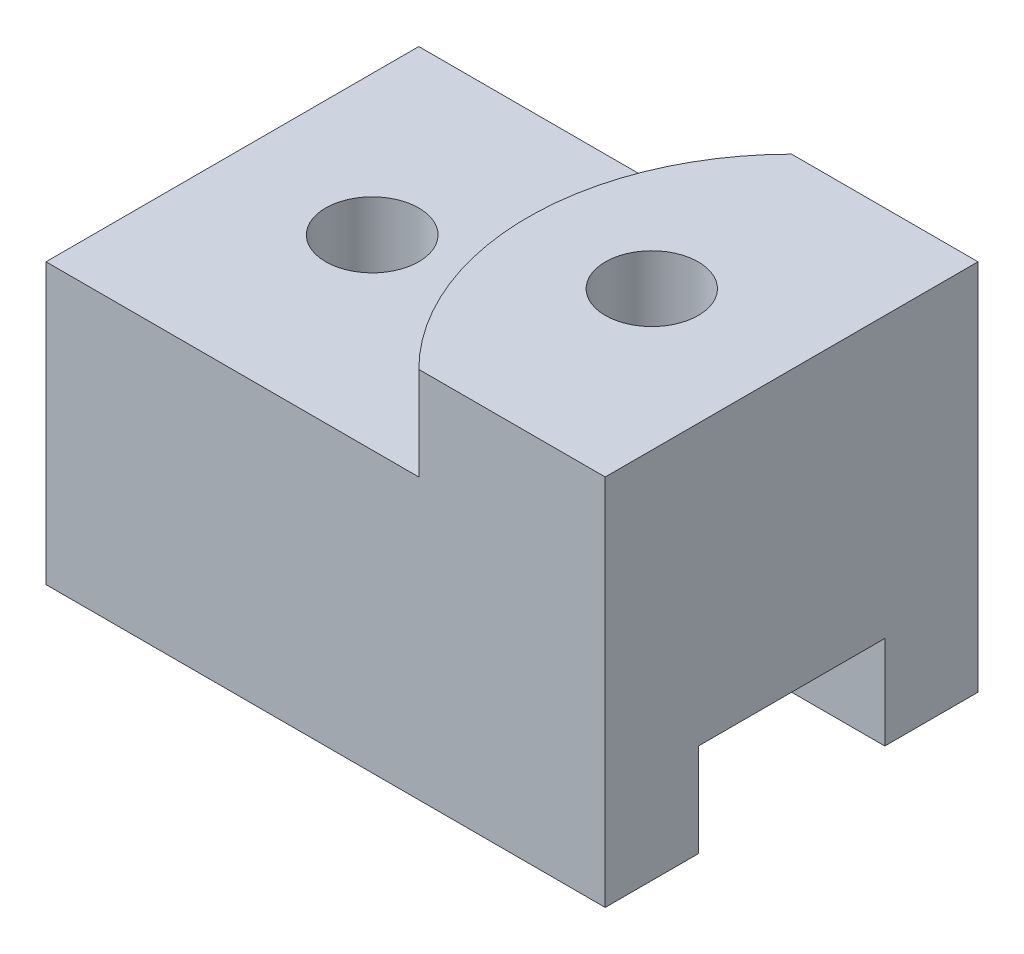
ISO-10303-21;
HEADER;
FILE_DESCRIPTION(('STEP AP214'),'2;1');
FILE_NAME('part.step','',(''),(''),'','','');
FILE_SCHEMA(('AUTOMOTIVE_DESIGN { 1 0 10303 214 1 1 1 1 }'));
ENDSEC;
DATA;
#1=APPLICATION_CONTEXT('core data for automotive mechanical design processes');
#2=APPLICATION_PROTOCOL_DEFINITION('international standard','automotive_design',2000,#1);
#3=PRODUCT_CONTEXT('',#1,'mechanical');
#4=PRODUCT('Part','Part','',(#3));
#5=PRODUCT_RELATED_PRODUCT_CATEGORY('part','',(#4));
#6=PRODUCT_DEFINITION_FORMATION('','',#4);
#7=PRODUCT_DEFINITION_CONTEXT('part definition',#1,'design');
#8=PRODUCT_DEFINITION('design','',#6,#7);
#9=PRODUCT_DEFINITION_SHAPE('','',#8);
#10=(LENGTH_UNIT() NAMED_UNIT(*) SI_UNIT(.MILLI.,.METRE.));
#11=(NAMED_UNIT(*) PLANE_ANGLE_UNIT() SI_UNIT($,.RADIAN.));
#12=(NAMED_UNIT(*) SI_UNIT($,.STERADIAN.) SOLID_ANGLE_UNIT());
#13=UNCERTAINTY_MEASURE_WITH_UNIT(LENGTH_MEASURE(1.E-05),#10,'distance_accuracy_value','');
#14=(GEOMETRIC_REPRESENTATION_CONTEXT(3) GLOBAL_UNCERTAINTY_ASSIGNED_CONTEXT((#13)) GLOBAL_UNIT_ASSIGNED_CONTEXT((#10,
#11,#12)) REPRESENTATION_CONTEXT('',''));
#15=CARTESIAN_POINT('',(0.,0.,0.));
#16=DIRECTION('',(0.,0.,1.));
#17=DIRECTION('',(1.,0.,0.));
#18=AXIS2_PLACEMENT_3D('',#15,#16,#17);
#19=CARTESIAN_POINT('',(38.1,25.4,-50.8));
#20=DIRECTION('',(0.,1.,0.));
#21=DIRECTION('',(0.,0.,1.));
#22=AXIS2_PLACEMENT_3D('',#19,#20,#21);
#23=CYLINDRICAL_SURFACE('',#22,12.7);
#24=CARTESIAN_POINT('',(38.1,76.2,-50.8));
#25=DIRECTION('',(0.,1.,0.));
#26=DIRECTION('',(0.,0.,1.));
#27=AXIS2_PLACEMENT_3D('',#24,#25,#26);
#28=CIRCLE('',#27,12.7);
#29=CARTESIAN_POINT('',(38.1,76.2,-38.1));
#30=VERTEX_POINT('',#29);
#31=EDGE_CURVE('E296',#30,#30,#28,.T.);
#32=ORIENTED_EDGE('',*,*,#31,.T.);
#33=EDGE_LOOP('',(#32));
#34=FACE_BOUND('',#33,.T.);
#35=CARTESIAN_POINT('',(38.1,33.782,-50.8));
#36=DIRECTION('',(0.,-1.,0.));
#37=DIRECTION('',(0.,0.,-1.));
#38=AXIS2_PLACEMENT_3D('',#35,#36,#37);
#39=CIRCLE('',#38,12.7);
#40=CARTESIAN_POINT('',(38.1,33.782,-63.5));
#41=VERTEX_POINT('',#40);
#42=EDGE_CURVE('E49',#41,#41,#39,.F.);
#43=ORIENTED_EDGE('',*,*,#42,.F.);
#44=EDGE_LOOP('',(#43));
#45=FACE_BOUND('',#44,.T.);
#46=ADVANCED_FACE('F45',(#34,#45),#23,.F.);
#47=CARTESIAN_POINT('',(0.,101.6,0.));
#48=DIRECTION('',(-1.,0.,0.));
#49=DIRECTION('',(0.,0.,1.));
#50=AXIS2_PLACEMENT_3D('',#47,#48,#49);
#51=PLANE('',#50);
#52=DIRECTION('',(0.,-1.,0.));
#53=VECTOR('',#52,1.);
#54=CARTESIAN_POINT('',(0.,101.6,0.));
#55=LINE('',#54,#53);
#56=CARTESIAN_POINT('',(0.,76.2,0.));
#57=VERTEX_POINT('',#56);
#58=CARTESIAN_POINT('',(0.,0.,0.));
#59=VERTEX_POINT('',#58);
#60=EDGE_CURVE('E11',#57,#59,#55,.T.);
#61=ORIENTED_EDGE('',*,*,#60,.F.);
#62=DIRECTION('',(0.,0.,1.));
#63=VECTOR('',#62,1.);
#64=CARTESIAN_POINT('',(0.,76.2,-101.6));
#65=LINE('',#64,#63);
#66=CARTESIAN_POINT('',(0.,76.2,-101.6));
#67=VERTEX_POINT('',#66);
#68=EDGE_CURVE('E143',#67,#57,#65,.T.);
#69=ORIENTED_EDGE('',*,*,#68,.F.);
#70=DIRECTION('',(0.,-1.,0.));
#71=VECTOR('',#70,1.);
#72=CARTESIAN_POINT('',(0.,101.6,-101.6));
#73=LINE('',#72,#71);
#74=CARTESIAN_POINT('',(0.,0.,-101.6));
#75=VERTEX_POINT('',#74);
#76=EDGE_CURVE('E220',#67,#75,#73,.T.);
#77=ORIENTED_EDGE('',*,*,#76,.T.);
#78=DIRECTION('',(0.,0.,-1.));
#79=VECTOR('',#78,1.);
#80=CARTESIAN_POINT('',(0.,0.,0.));
#81=LINE('',#80,#79);
#82=CARTESIAN_POINT('',(0.,0.,-76.2));
#83=VERTEX_POINT('',#82);
#84=EDGE_CURVE('E194',#83,#75,#81,.T.);
#85=ORIENTED_EDGE('',*,*,#84,.F.);
#86=DIRECTION('',(0.,-1.,0.));
#87=VECTOR('',#86,1.);
#88=CARTESIAN_POINT('',(0.,25.4,-76.2));
#89=LINE('',#88,#87);
#90=CARTESIAN_POINT('',(0.,25.4,-76.2));
#91=VERTEX_POINT('',#90);
#92=EDGE_CURVE('E71',#91,#83,#89,.T.);
#93=ORIENTED_EDGE('',*,*,#92,.F.);
#94=DIRECTION('',(0.,0.,-1.));
#95=VECTOR('',#94,1.);
#96=CARTESIAN_POINT('',(0.,25.4,-25.4));
#97=LINE('',#96,#95);
#98=CARTESIAN_POINT('',(0.,25.4,-25.4));
#99=VERTEX_POINT('',#98);
#100=EDGE_CURVE('E170',#99,#91,#97,.T.);
#101=ORIENTED_EDGE('',*,*,#100,.F.);
#102=DIRECTION('',(0.,-1.,0.));
#103=VECTOR('',#102,1.);
#104=CARTESIAN_POINT('',(0.,25.4,-25.4));
#105=LINE('',#104,#103);
#106=CARTESIAN_POINT('',(0.,0.,-25.4));
#107=VERTEX_POINT('',#106);
#108=EDGE_CURVE('E190',#99,#107,#105,.T.);
#109=ORIENTED_EDGE('',*,*,#108,.T.);
#110=EDGE_CURVE('E204',#59,#107,#81,.T.);
#111=ORIENTED_EDGE('',*,*,#110,.F.);
#112=EDGE_LOOP('',(#61,#69,#77,#85,#93,#101,#109,#111));
#113=FACE_BOUND('',#112,.T.);
#114=ADVANCED_FACE('F47',(#113),#51,.T.);
#115=CARTESIAN_POINT('',(0.,0.,0.));
#116=DIRECTION('',(0.,-1.,0.));
#117=DIRECTION('',(0.,0.,-1.));
#118=AXIS2_PLACEMENT_3D('',#115,#116,#117);
#119=PLANE('',#118);
#120=DIRECTION('',(-1.,0.,0.));
#121=VECTOR('',#120,1.);
#122=CARTESIAN_POINT('',(0.,0.,-25.4));
#123=LINE('',#122,#121);
#124=CARTESIAN_POINT('',(152.4,0.,-25.4));
#125=VERTEX_POINT('',#124);
#126=EDGE_CURVE('E175',#125,#107,#123,.T.);
#127=ORIENTED_EDGE('',*,*,#126,.F.);
#128=DIRECTION('',(0.,0.,1.));
#129=VECTOR('',#128,1.);
#130=CARTESIAN_POINT('',(152.4,0.,-101.6));
#131=LINE('',#130,#129);
#132=CARTESIAN_POINT('',(152.4,0.,0.));
#133=VERTEX_POINT('',#132);
#134=EDGE_CURVE('E212',#125,#133,#131,.T.);
#135=ORIENTED_EDGE('',*,*,#134,.T.);
#136=DIRECTION('',(-1.,0.,0.));
#137=VECTOR('',#136,1.);
#138=CARTESIAN_POINT('',(152.4,0.,0.));
#139=LINE('',#138,#137);
#140=EDGE_CURVE('E217',#133,#59,#139,.T.);
#141=ORIENTED_EDGE('',*,*,#140,.T.);
#142=ORIENTED_EDGE('',*,*,#110,.T.);
#143=EDGE_LOOP('',(#127,#135,#141,#142));
#144=FACE_BOUND('',#143,.T.);
#145=ADVANCED_FACE('F250',(#144),#119,.T.);
#146=CARTESIAN_POINT('',(152.4,101.6,0.));
#147=DIRECTION('',(0.,0.,1.));
#148=DIRECTION('',(1.,0.,0.));
#149=AXIS2_PLACEMENT_3D('',#146,#147,#148);
#150=PLANE('',#149);
#151=DIRECTION('',(0.,-1.,0.));
#152=VECTOR('',#151,1.);
#153=CARTESIAN_POINT('',(152.4,101.6,0.));
#154=LINE('',#153,#152);
#155=CARTESIAN_POINT('',(152.4,101.6,0.));
#156=VERTEX_POINT('',#155);
#157=EDGE_CURVE('E55',#156,#133,#154,.T.);
#158=ORIENTED_EDGE('',*,*,#157,.F.);
#159=DIRECTION('',(-1.,0.,0.));
#160=VECTOR('',#159,1.);
#161=CARTESIAN_POINT('',(152.4,101.6,0.));
#162=LINE('',#161,#160);
#163=CARTESIAN_POINT('',(101.6,101.6,0.));
#164=VERTEX_POINT('',#163);
#165=EDGE_CURVE('E148',#156,#164,#162,.T.);
#166=ORIENTED_EDGE('',*,*,#165,.T.);
#167=DIRECTION('',(0.,-1.,0.));
#168=VECTOR('',#167,1.);
#169=CARTESIAN_POINT('',(101.6,101.6,0.));
#170=LINE('',#169,#168);
#171=CARTESIAN_POINT('',(101.6,76.2,0.));
#172=VERTEX_POINT('',#171);
#173=EDGE_CURVE('E144',#164,#172,#170,.T.);
#174=ORIENTED_EDGE('',*,*,#173,.T.);
#175=DIRECTION('',(1.,0.,0.));
#176=VECTOR('',#175,1.);
#177=CARTESIAN_POINT('',(0.,76.2,0.));
#178=LINE('',#177,#176);
#179=EDGE_CURVE('E163',#57,#172,#178,.T.);
#180=ORIENTED_EDGE('',*,*,#179,.F.);
#181=ORIENTED_EDGE('',*,*,#60,.T.);
#182=ORIENTED_EDGE('',*,*,#140,.F.);
#183=EDGE_LOOP('',(#158,#166,#174,#180,#181,#182));
#184=FACE_BOUND('',#183,.T.);
#185=ADVANCED_FACE('F255',(#184),#150,.T.);
#186=CARTESIAN_POINT('',(152.4,101.6,-101.6));
#187=DIRECTION('',(1.,0.,0.));
#188=DIRECTION('',(0.,0.,-1.));
#189=AXIS2_PLACEMENT_3D('',#186,#187,#188);
#190=PLANE('',#189);
#191=DIRECTION('',(0.,-1.,0.));
#192=VECTOR('',#191,1.);
#193=CARTESIAN_POINT('',(152.4,101.6,-101.6));
#194=LINE('',#193,#192);
#195=CARTESIAN_POINT('',(152.4,101.6,-101.6));
#196=VERTEX_POINT('',#195);
#197=CARTESIAN_POINT('',(152.4,0.,-101.6));
#198=VERTEX_POINT('',#197);
#199=EDGE_CURVE('E224',#196,#198,#194,.T.);
#200=ORIENTED_EDGE('',*,*,#199,.F.);
#201=DIRECTION('',(0.,0.,1.));
#202=VECTOR('',#201,1.);
#203=CARTESIAN_POINT('',(152.4,101.6,-101.6));
#204=LINE('',#203,#202);
#205=EDGE_CURVE('E133',#196,#156,#204,.T.);
#206=ORIENTED_EDGE('',*,*,#205,.T.);
#207=ORIENTED_EDGE('',*,*,#157,.T.);
#208=ORIENTED_EDGE('',*,*,#134,.F.);
#209=DIRECTION('',(0.,-1.,0.));
#210=VECTOR('',#209,1.);
#211=CARTESIAN_POINT('',(152.4,25.4,-25.4));
#212=LINE('',#211,#210);
#213=CARTESIAN_POINT('',(152.4,25.4,-25.4));
#214=VERTEX_POINT('',#213);
#215=EDGE_CURVE('E195',#214,#125,#212,.T.);
#216=ORIENTED_EDGE('',*,*,#215,.F.);
#217=DIRECTION('',(0.,0.,1.));
#218=VECTOR('',#217,1.);
#219=CARTESIAN_POINT('',(152.4,25.4,-76.2));
#220=LINE('',#219,#218);
#221=CARTESIAN_POINT('',(152.4,25.4,-76.2));
#222=VERTEX_POINT('',#221);
#223=EDGE_CURVE('E179',#222,#214,#220,.T.);
#224=ORIENTED_EDGE('',*,*,#223,.F.);
#225=DIRECTION('',(0.,-1.,0.));
#226=VECTOR('',#225,1.);
#227=CARTESIAN_POINT('',(152.4,25.4,-76.2));
#228=LINE('',#227,#226);
#229=CARTESIAN_POINT('',(152.4,0.,-76.2));
#230=VERTEX_POINT('',#229);
#231=EDGE_CURVE('E198',#222,#230,#228,.T.);
#232=ORIENTED_EDGE('',*,*,#231,.T.);
#233=EDGE_CURVE('E213',#198,#230,#131,.T.);
#234=ORIENTED_EDGE('',*,*,#233,.F.);
#235=EDGE_LOOP('',(#200,#206,#207,#208,#216,#224,#232,#234));
#236=FACE_BOUND('',#235,.T.);
#237=ADVANCED_FACE('F238',(#236),#190,.T.);
#238=CARTESIAN_POINT('',(0.,101.6,-101.6));
#239=DIRECTION('',(0.,0.,-1.));
#240=DIRECTION('',(-1.,0.,0.));
#241=AXIS2_PLACEMENT_3D('',#238,#239,#240);
#242=PLANE('',#241);
#243=DIRECTION('',(-1.,0.,0.));
#244=VECTOR('',#243,1.);
#245=CARTESIAN_POINT('',(76.2,76.2,-101.6));
#246=LINE('',#245,#244);
#247=CARTESIAN_POINT('',(101.6,76.2,-101.6));
#248=VERTEX_POINT('',#247);
#249=EDGE_CURVE('E141',#248,#67,#246,.T.);
#250=ORIENTED_EDGE('',*,*,#249,.F.);
#251=DIRECTION('',(0.,-1.,0.));
#252=VECTOR('',#251,1.);
#253=CARTESIAN_POINT('',(101.6,101.6,-101.6));
#254=LINE('',#253,#252);
#255=CARTESIAN_POINT('',(101.6,101.6,-101.6));
#256=VERTEX_POINT('',#255);
#257=EDGE_CURVE('E63',#256,#248,#254,.T.);
#258=ORIENTED_EDGE('',*,*,#257,.F.);
#259=DIRECTION('',(-1.,0.,0.));
#260=VECTOR('',#259,1.);
#261=CARTESIAN_POINT('',(152.4,101.6,-101.6));
#262=LINE('',#261,#260);
#263=EDGE_CURVE('E127',#196,#256,#262,.T.);
#264=ORIENTED_EDGE('',*,*,#263,.F.);
#265=ORIENTED_EDGE('',*,*,#199,.T.);
#266=DIRECTION('',(1.,0.,0.));
#267=VECTOR('',#266,1.);
#268=CARTESIAN_POINT('',(0.,0.,-101.6));
#269=LINE('',#268,#267);
#270=EDGE_CURVE('E208',#75,#198,#269,.T.);
#271=ORIENTED_EDGE('',*,*,#270,.F.);
#272=ORIENTED_EDGE('',*,*,#76,.F.);
#273=EDGE_LOOP('',(#250,#258,#264,#265,#271,#272));
#274=FACE_BOUND('',#273,.T.);
#275=ADVANCED_FACE('F139',(#274),#242,.T.);
#276=DIRECTION('',(1.,0.,0.));
#277=VECTOR('',#276,1.);
#278=CARTESIAN_POINT('',(0.,0.,-76.2));
#279=LINE('',#278,#277);
#280=EDGE_CURVE('E169',#83,#230,#279,.T.);
#281=ORIENTED_EDGE('',*,*,#280,.F.);
#282=ORIENTED_EDGE('',*,*,#84,.T.);
#283=ORIENTED_EDGE('',*,*,#270,.T.);
#284=ORIENTED_EDGE('',*,*,#233,.T.);
#285=EDGE_LOOP('',(#281,#282,#283,#284));
#286=FACE_BOUND('',#285,.T.);
#287=ADVANCED_FACE('F234',(#286),#119,.T.);
#288=CARTESIAN_POINT('',(0.,25.4,-25.4));
#289=DIRECTION('',(0.,0.,1.));
#290=DIRECTION('',(1.,0.,0.));
#291=AXIS2_PLACEMENT_3D('',#288,#289,#290);
#292=PLANE('',#291);
#293=ORIENTED_EDGE('',*,*,#126,.T.);
#294=ORIENTED_EDGE('',*,*,#108,.F.);
#295=DIRECTION('',(-1.,0.,0.));
#296=VECTOR('',#295,1.);
#297=CARTESIAN_POINT('',(0.,25.4,-25.4));
#298=LINE('',#297,#296);
#299=EDGE_CURVE('E182',#214,#99,#298,.T.);
#300=ORIENTED_EDGE('',*,*,#299,.F.);
#301=ORIENTED_EDGE('',*,*,#215,.T.);
#302=EDGE_LOOP('',(#293,#294,#300,#301));
#303=FACE_BOUND('',#302,.T.);
#304=ADVANCED_FACE('F409',(#303),#292,.F.);
#305=CARTESIAN_POINT('',(0.,25.4,-76.2));
#306=DIRECTION('',(0.,0.,-1.));
#307=DIRECTION('',(-1.,0.,0.));
#308=AXIS2_PLACEMENT_3D('',#305,#306,#307);
#309=PLANE('',#308);
#310=ORIENTED_EDGE('',*,*,#280,.T.);
#311=ORIENTED_EDGE('',*,*,#231,.F.);
#312=DIRECTION('',(1.,0.,0.));
#313=VECTOR('',#312,1.);
#314=CARTESIAN_POINT('',(0.,25.4,-76.2));
#315=LINE('',#314,#313);
#316=EDGE_CURVE('E174',#91,#222,#315,.T.);
#317=ORIENTED_EDGE('',*,*,#316,.F.);
#318=ORIENTED_EDGE('',*,*,#92,.T.);
#319=EDGE_LOOP('',(#310,#311,#317,#318));
#320=FACE_BOUND('',#319,.T.);
#321=ADVANCED_FACE('F241',(#320),#309,.F.);
#322=CARTESIAN_POINT('',(0.,25.4,0.));
#323=DIRECTION('',(0.,-1.,0.));
#324=DIRECTION('',(0.,0.,-1.));
#325=AXIS2_PLACEMENT_3D('',#322,#323,#324);
#326=PLANE('',#325);
#327=CARTESIAN_POINT('',(38.1,25.4,-50.8));
#328=DIRECTION('',(0.,-1.,0.));
#329=DIRECTION('',(0.,0.,-1.));
#330=AXIS2_PLACEMENT_3D('',#327,#328,#329);
#331=CIRCLE('',#330,19.05);
#332=CARTESIAN_POINT('',(38.1,25.4,-69.85));
#333=VERTEX_POINT('',#332);
#334=EDGE_CURVE('E303',#333,#333,#331,.T.);
#335=ORIENTED_EDGE('',*,*,#334,.F.);
#336=EDGE_LOOP('',(#335));
#337=FACE_BOUND('',#336,.T.);
#338=CARTESIAN_POINT('',(114.3,25.4,-50.8));
#339=DIRECTION('',(0.,-1.,0.));
#340=DIRECTION('',(0.,0.,-1.));
#341=AXIS2_PLACEMENT_3D('',#338,#339,#340);
#342=CIRCLE('',#341,12.6651621666417);
#343=CARTESIAN_POINT('',(114.3,25.4,-63.4651621666417));
#344=VERTEX_POINT('',#343);
#345=EDGE_CURVE('E158',#344,#344,#342,.T.);
#346=ORIENTED_EDGE('',*,*,#345,.F.);
#347=EDGE_LOOP('',(#346));
#348=FACE_BOUND('',#347,.T.);
#349=ORIENTED_EDGE('',*,*,#100,.T.);
#350=ORIENTED_EDGE('',*,*,#316,.T.);
#351=ORIENTED_EDGE('',*,*,#223,.T.);
#352=ORIENTED_EDGE('',*,*,#299,.T.);
#353=EDGE_LOOP('',(#349,#350,#351,#352));
#354=FACE_BOUND('',#353,.T.);
#355=ADVANCED_FACE('F243',(#337,#348,#354),#326,.T.);
#356=CARTESIAN_POINT('',(0.,76.2,0.));
#357=DIRECTION('',(0.,1.,0.));
#358=DIRECTION('',(0.,0.,1.));
#359=AXIS2_PLACEMENT_3D('',#356,#357,#358);
#360=PLANE('',#359);
#361=ORIENTED_EDGE('',*,*,#31,.F.);
#362=EDGE_LOOP('',(#361));
#363=FACE_BOUND('',#362,.T.);
#364=ORIENTED_EDGE('',*,*,#179,.T.);
#365=CARTESIAN_POINT('',(152.4,76.2,-50.8));
#366=DIRECTION('',(0.,-1.,0.));
#367=DIRECTION('',(0.,0.,-1.));
#368=AXIS2_PLACEMENT_3D('',#365,#366,#367);
#369=CIRCLE('',#368,71.8420489685532);
#370=EDGE_CURVE('E136',#172,#248,#369,.T.);
#371=ORIENTED_EDGE('',*,*,#370,.T.);
#372=ORIENTED_EDGE('',*,*,#249,.T.);
#373=ORIENTED_EDGE('',*,*,#68,.T.);
#374=EDGE_LOOP('',(#364,#371,#372,#373));
#375=FACE_BOUND('',#374,.T.);
#376=ADVANCED_FACE('F258',(#363,#375),#360,.T.);
#377=CARTESIAN_POINT('',(152.4,101.6,-50.8));
#378=DIRECTION('',(0.,-1.,0.));
#379=DIRECTION('',(0.,0.,-1.));
#380=AXIS2_PLACEMENT_3D('',#377,#378,#379);
#381=CYLINDRICAL_SURFACE('',#380,71.8420489685532);
#382=ORIENTED_EDGE('',*,*,#370,.F.);
#383=ORIENTED_EDGE('',*,*,#173,.F.);
#384=CARTESIAN_POINT('',(152.4,101.6,-50.8));
#385=DIRECTION('',(0.,-1.,0.));
#386=DIRECTION('',(0.,0.,-1.));
#387=AXIS2_PLACEMENT_3D('',#384,#385,#386);
#388=CIRCLE('',#387,71.8420489685532);
#389=EDGE_CURVE('E130',#164,#256,#388,.T.);
#390=ORIENTED_EDGE('',*,*,#389,.T.);
#391=ORIENTED_EDGE('',*,*,#257,.T.);
#392=EDGE_LOOP('',(#382,#383,#390,#391));
#393=FACE_BOUND('',#392,.T.);
#394=ADVANCED_FACE('F146',(#393),#381,.T.);
#395=CARTESIAN_POINT('',(152.4,101.6,-50.8));
#396=DIRECTION('',(0.,-1.,0.));
#397=DIRECTION('',(0.,0.,-1.));
#398=AXIS2_PLACEMENT_3D('',#395,#396,#397);
#399=PLANE('',#398);
#400=CARTESIAN_POINT('',(114.3,101.6,-50.8));
#401=DIRECTION('',(0.,1.,0.));
#402=DIRECTION('',(0.,0.,1.));
#403=AXIS2_PLACEMENT_3D('',#400,#401,#402);
#404=CIRCLE('',#403,12.6651621666417);
#405=CARTESIAN_POINT('',(114.3,101.6,-38.1348378333583));
#406=VERTEX_POINT('',#405);
#407=EDGE_CURVE('E293',#406,#406,#404,.T.);
#408=ORIENTED_EDGE('',*,*,#407,.F.);
#409=EDGE_LOOP('',(#408));
#410=FACE_BOUND('',#409,.T.);
#411=ORIENTED_EDGE('',*,*,#263,.T.);
#412=ORIENTED_EDGE('',*,*,#389,.F.);
#413=ORIENTED_EDGE('',*,*,#165,.F.);
#414=ORIENTED_EDGE('',*,*,#205,.F.);
#415=EDGE_LOOP('',(#411,#412,#413,#414));
#416=FACE_BOUND('',#415,.T.);
#417=ADVANCED_FACE('F128',(#410,#416),#399,.F.);
#418=CARTESIAN_POINT('',(114.3,0.,-50.8));
#419=DIRECTION('',(0.,1.,0.));
#420=DIRECTION('',(0.,0.,1.));
#421=AXIS2_PLACEMENT_3D('',#418,#419,#420);
#422=CYLINDRICAL_SURFACE('',#421,12.6651621666417);
#423=ORIENTED_EDGE('',*,*,#345,.T.);
#424=EDGE_LOOP('',(#423));
#425=FACE_BOUND('',#424,.T.);
#426=ORIENTED_EDGE('',*,*,#407,.T.);
#427=EDGE_LOOP('',(#426));
#428=FACE_BOUND('',#427,.T.);
#429=ADVANCED_FACE('F283',(#425,#428),#422,.F.);
#430=CARTESIAN_POINT('',(38.1,33.782,-50.8));
#431=DIRECTION('',(0.,-1.,0.));
#432=DIRECTION('',(0.,0.,-1.));
#433=AXIS2_PLACEMENT_3D('',#430,#431,#432);
#434=PLANE('',#433);
#435=CARTESIAN_POINT('',(38.1,33.782,-50.8));
#436=DIRECTION('',(0.,-1.,0.));
#437=DIRECTION('',(0.,0.,-1.));
#438=AXIS2_PLACEMENT_3D('',#435,#436,#437);
#439=CIRCLE('',#438,19.05);
#440=CARTESIAN_POINT('',(38.1,33.782,-69.85));
#441=VERTEX_POINT('',#440);
#442=EDGE_CURVE('E307',#441,#441,#439,.T.);
#443=ORIENTED_EDGE('',*,*,#442,.T.);
#444=EDGE_LOOP('',(#443));
#445=FACE_BOUND('',#444,.T.);
#446=ORIENTED_EDGE('',*,*,#42,.T.);
#447=EDGE_LOOP('',(#446));
#448=FACE_BOUND('',#447,.T.);
#449=ADVANCED_FACE('F285',(#445,#448),#434,.T.);
#450=CARTESIAN_POINT('',(38.1,33.782,-50.8));
#451=DIRECTION('',(0.,-1.,0.));
#452=DIRECTION('',(0.,0.,-1.));
#453=AXIS2_PLACEMENT_3D('',#450,#451,#452);
#454=CYLINDRICAL_SURFACE('',#453,19.05);
#455=ORIENTED_EDGE('',*,*,#442,.F.);
#456=EDGE_LOOP('',(#455));
#457=FACE_BOUND('',#456,.T.);
#458=ORIENTED_EDGE('',*,*,#334,.T.);
#459=EDGE_LOOP('',(#458));
#460=FACE_BOUND('',#459,.T.);
#461=ADVANCED_FACE('F281',(#457,#460),#454,.F.);
#462=CLOSED_SHELL('',(#46,#114,#145,#185,#237,#275,#287,#304,#321,#355,#376,#394,#417,#429,#449,#461));
#463=MANIFOLD_SOLID_BREP('B2',#462);
#464=ADVANCED_BREP_SHAPE_REPRESENTATION('',(#18,#463),#14);
#465=SHAPE_DEFINITION_REPRESENTATION(#9,#464);
ENDSEC;
END-ISO-10303-21;
